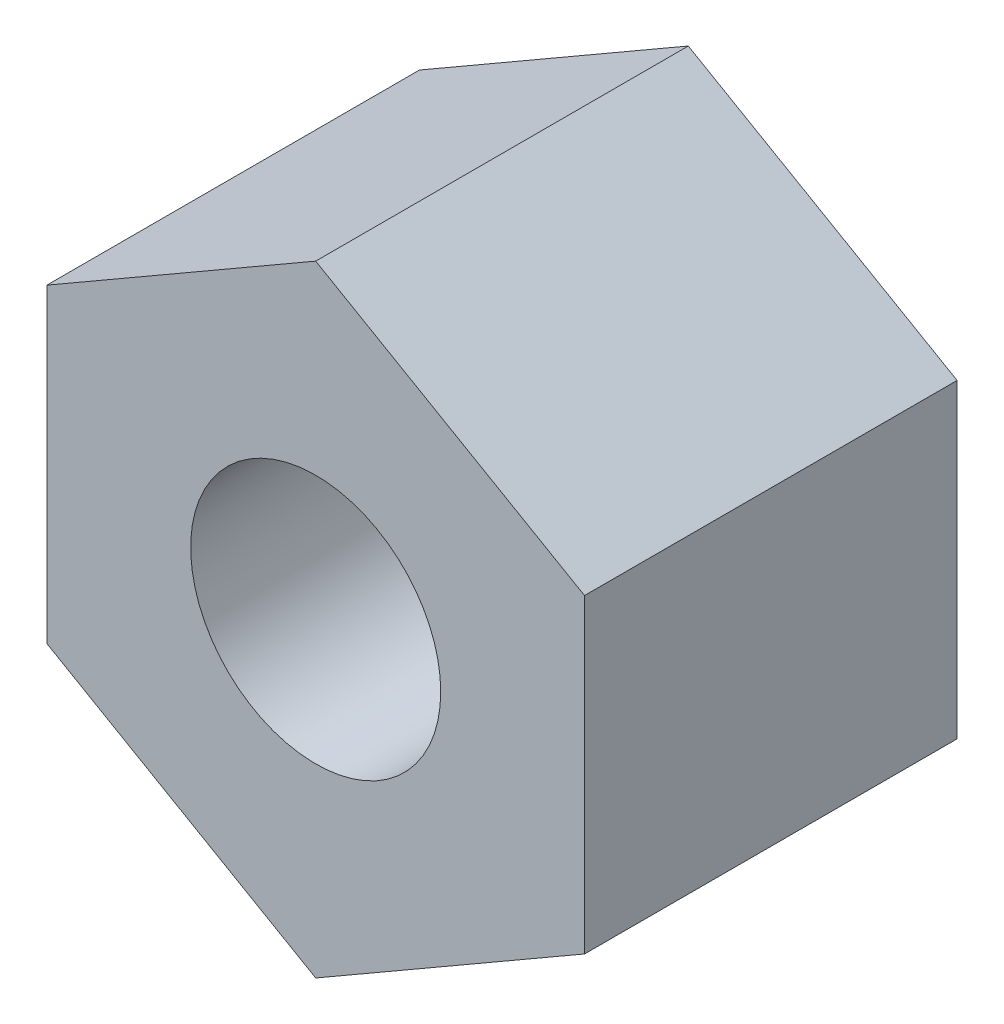
ISO-10303-21;
HEADER;
FILE_DESCRIPTION(('STEP AP214'),'2;1');
FILE_NAME('part.step','',(''),(''),'','','');
FILE_SCHEMA(('AUTOMOTIVE_DESIGN { 1 0 10303 214 1 1 1 1 }'));
ENDSEC;
DATA;
#1=APPLICATION_CONTEXT('core data for automotive mechanical design processes');
#2=APPLICATION_PROTOCOL_DEFINITION('international standard','automotive_design',2000,#1);
#3=PRODUCT_CONTEXT('',#1,'mechanical');
#4=PRODUCT('Part','Part','',(#3));
#5=PRODUCT_RELATED_PRODUCT_CATEGORY('part','',(#4));
#6=PRODUCT_DEFINITION_FORMATION('','',#4);
#7=PRODUCT_DEFINITION_CONTEXT('part definition',#1,'design');
#8=PRODUCT_DEFINITION('design','',#6,#7);
#9=PRODUCT_DEFINITION_SHAPE('','',#8);
#10=(LENGTH_UNIT() NAMED_UNIT(*) SI_UNIT(.MILLI.,.METRE.));
#11=(NAMED_UNIT(*) PLANE_ANGLE_UNIT() SI_UNIT($,.RADIAN.));
#12=(NAMED_UNIT(*) SI_UNIT($,.STERADIAN.) SOLID_ANGLE_UNIT());
#13=UNCERTAINTY_MEASURE_WITH_UNIT(LENGTH_MEASURE(1.E-05),#10,'distance_accuracy_value','');
#14=(GEOMETRIC_REPRESENTATION_CONTEXT(3) GLOBAL_UNCERTAINTY_ASSIGNED_CONTEXT((#13)) GLOBAL_UNIT_ASSIGNED_CONTEXT((#10,
#11,#12)) REPRESENTATION_CONTEXT('',''));
#15=CARTESIAN_POINT('',(0.,0.,0.));
#16=DIRECTION('',(0.,0.,1.));
#17=DIRECTION('',(1.,0.,0.));
#18=AXIS2_PLACEMENT_3D('',#15,#16,#17);
#19=CARTESIAN_POINT('',(4.29999999999997,2.48260615751544,5.96));
#20=DIRECTION('',(-0.499999999999995,-0.866025403784441,0.));
#21=DIRECTION('',(0.866025403784442,-0.499999999999995,0.));
#22=AXIS2_PLACEMENT_3D('',#19,#20,#21);
#23=PLANE('',#22);
#24=DIRECTION('',(-0.866025403784441,0.499999999999995,0.));
#25=VECTOR('',#24,1.);
#26=CARTESIAN_POINT('',(4.29999999999997,2.48260615751544,0.));
#27=LINE('',#26,#25);
#28=CARTESIAN_POINT('',(4.29999999999997,2.48260615751544,0.));
#29=VERTEX_POINT('',#28);
#30=CARTESIAN_POINT('',(0.,4.96521231503079,0.));
#31=VERTEX_POINT('',#30);
#32=EDGE_CURVE('E123',#29,#31,#27,.T.);
#33=ORIENTED_EDGE('',*,*,#32,.T.);
#34=DIRECTION('',(0.,0.,-1.));
#35=VECTOR('',#34,1.);
#36=CARTESIAN_POINT('',(0.,4.96521231503079,5.96));
#37=LINE('',#36,#35);
#38=CARTESIAN_POINT('',(0.,4.96521231503079,5.96));
#39=VERTEX_POINT('',#38);
#40=EDGE_CURVE('E11',#39,#31,#37,.T.);
#41=ORIENTED_EDGE('',*,*,#40,.F.);
#42=DIRECTION('',(-0.866025403784441,0.499999999999995,0.));
#43=VECTOR('',#42,1.);
#44=CARTESIAN_POINT('',(4.29999999999997,2.48260615751544,5.96));
#45=LINE('',#44,#43);
#46=CARTESIAN_POINT('',(4.29999999999997,2.48260615751544,5.96));
#47=VERTEX_POINT('',#46);
#48=EDGE_CURVE('E134',#47,#39,#45,.T.);
#49=ORIENTED_EDGE('',*,*,#48,.F.);
#50=DIRECTION('',(0.,0.,-1.));
#51=VECTOR('',#50,1.);
#52=CARTESIAN_POINT('',(4.29999999999997,2.48260615751544,5.96));
#53=LINE('',#52,#51);
#54=EDGE_CURVE('E119',#47,#29,#53,.T.);
#55=ORIENTED_EDGE('',*,*,#54,.T.);
#56=EDGE_LOOP('',(#33,#41,#49,#55));
#57=FACE_BOUND('',#56,.T.);
#58=ADVANCED_FACE('F39',(#57),#23,.F.);
#59=CARTESIAN_POINT('',(0.,4.96521231503079,5.96));
#60=DIRECTION('',(0.500000000000001,-0.866025403784438,0.));
#61=DIRECTION('',(0.866025403784438,0.500000000000001,0.));
#62=AXIS2_PLACEMENT_3D('',#59,#60,#61);
#63=PLANE('',#62);
#64=DIRECTION('',(-0.866025403784438,-0.500000000000001,0.));
#65=VECTOR('',#64,1.);
#66=CARTESIAN_POINT('',(0.,4.96521231503079,0.));
#67=LINE('',#66,#65);
#68=CARTESIAN_POINT('',(-4.30000000000001,2.48260615751538,0.));
#69=VERTEX_POINT('',#68);
#70=EDGE_CURVE('E126',#31,#69,#67,.T.);
#71=ORIENTED_EDGE('',*,*,#70,.T.);
#72=DIRECTION('',(0.,0.,-1.));
#73=VECTOR('',#72,1.);
#74=CARTESIAN_POINT('',(-4.30000000000001,2.48260615751538,5.96));
#75=LINE('',#74,#73);
#76=CARTESIAN_POINT('',(-4.30000000000001,2.48260615751538,5.96));
#77=VERTEX_POINT('',#76);
#78=EDGE_CURVE('E47',#77,#69,#75,.T.);
#79=ORIENTED_EDGE('',*,*,#78,.F.);
#80=DIRECTION('',(-0.866025403784438,-0.500000000000001,0.));
#81=VECTOR('',#80,1.);
#82=CARTESIAN_POINT('',(0.,4.96521231503079,5.96));
#83=LINE('',#82,#81);
#84=EDGE_CURVE('E92',#39,#77,#83,.T.);
#85=ORIENTED_EDGE('',*,*,#84,.F.);
#86=ORIENTED_EDGE('',*,*,#40,.T.);
#87=EDGE_LOOP('',(#71,#79,#85,#86));
#88=FACE_BOUND('',#87,.T.);
#89=ADVANCED_FACE('F159',(#88),#63,.F.);
#90=CARTESIAN_POINT('',(-4.30000000000001,2.48260615751538,5.96));
#91=DIRECTION('',(1.,0.,0.));
#92=DIRECTION('',(0.,1.,0.));
#93=AXIS2_PLACEMENT_3D('',#90,#91,#92);
#94=PLANE('',#93);
#95=DIRECTION('',(0.,-1.,0.));
#96=VECTOR('',#95,1.);
#97=CARTESIAN_POINT('',(-4.30000000000001,2.48260615751538,0.));
#98=LINE('',#97,#96);
#99=CARTESIAN_POINT('',(-4.29999999999999,-2.48260615751541,0.));
#100=VERTEX_POINT('',#99);
#101=EDGE_CURVE('E129',#69,#100,#98,.T.);
#102=ORIENTED_EDGE('',*,*,#101,.T.);
#103=DIRECTION('',(0.,0.,-1.));
#104=VECTOR('',#103,1.);
#105=CARTESIAN_POINT('',(-4.29999999999999,-2.48260615751541,5.96));
#106=LINE('',#105,#104);
#107=CARTESIAN_POINT('',(-4.29999999999999,-2.48260615751541,5.96));
#108=VERTEX_POINT('',#107);
#109=EDGE_CURVE('E114',#108,#100,#106,.T.);
#110=ORIENTED_EDGE('',*,*,#109,.F.);
#111=DIRECTION('',(0.,-1.,0.));
#112=VECTOR('',#111,1.);
#113=CARTESIAN_POINT('',(-4.30000000000001,2.48260615751538,5.96));
#114=LINE('',#113,#112);
#115=EDGE_CURVE('E105',#77,#108,#114,.T.);
#116=ORIENTED_EDGE('',*,*,#115,.F.);
#117=ORIENTED_EDGE('',*,*,#78,.T.);
#118=EDGE_LOOP('',(#102,#110,#116,#117));
#119=FACE_BOUND('',#118,.T.);
#120=ADVANCED_FACE('F140',(#119),#94,.F.);
#121=CARTESIAN_POINT('',(-4.29999999999999,-2.48260615751541,5.96));
#122=DIRECTION('',(0.499999999999995,0.866025403784442,0.));
#123=DIRECTION('',(-0.866025403784442,0.499999999999995,0.));
#124=AXIS2_PLACEMENT_3D('',#121,#122,#123);
#125=PLANE('',#124);
#126=DIRECTION('',(0.866025403784442,-0.499999999999995,0.));
#127=VECTOR('',#126,1.);
#128=CARTESIAN_POINT('',(-4.29999999999999,-2.48260615751541,0.));
#129=LINE('',#128,#127);
#130=CARTESIAN_POINT('',(0.,-4.96521231503079,0.));
#131=VERTEX_POINT('',#130);
#132=EDGE_CURVE('E113',#100,#131,#129,.T.);
#133=ORIENTED_EDGE('',*,*,#132,.T.);
#134=DIRECTION('',(0.,0.,-1.));
#135=VECTOR('',#134,1.);
#136=CARTESIAN_POINT('',(0.,-4.96521231503079,5.96));
#137=LINE('',#136,#135);
#138=CARTESIAN_POINT('',(0.,-4.96521231503079,5.96));
#139=VERTEX_POINT('',#138);
#140=EDGE_CURVE('E110',#139,#131,#137,.T.);
#141=ORIENTED_EDGE('',*,*,#140,.F.);
#142=DIRECTION('',(0.866025403784442,-0.499999999999995,0.));
#143=VECTOR('',#142,1.);
#144=CARTESIAN_POINT('',(-4.29999999999999,-2.48260615751541,5.96));
#145=LINE('',#144,#143);
#146=EDGE_CURVE('E99',#108,#139,#145,.T.);
#147=ORIENTED_EDGE('',*,*,#146,.F.);
#148=ORIENTED_EDGE('',*,*,#109,.T.);
#149=EDGE_LOOP('',(#133,#141,#147,#148));
#150=FACE_BOUND('',#149,.T.);
#151=ADVANCED_FACE('F111',(#150),#125,.F.);
#152=CARTESIAN_POINT('',(0.,-4.96521231503079,5.96));
#153=DIRECTION('',(-0.500000000000007,0.866025403784434,0.));
#154=DIRECTION('',(-0.866025403784435,-0.500000000000007,0.));
#155=AXIS2_PLACEMENT_3D('',#152,#153,#154);
#156=PLANE('',#155);
#157=DIRECTION('',(0.866025403784434,0.500000000000007,0.));
#158=VECTOR('',#157,1.);
#159=CARTESIAN_POINT('',(0.,-4.96521231503079,0.));
#160=LINE('',#159,#158);
#161=CARTESIAN_POINT('',(4.30000000000003,-2.48260615751535,0.));
#162=VERTEX_POINT('',#161);
#163=EDGE_CURVE('E78',#131,#162,#160,.T.);
#164=ORIENTED_EDGE('',*,*,#163,.T.);
#165=DIRECTION('',(0.,0.,-1.));
#166=VECTOR('',#165,1.);
#167=CARTESIAN_POINT('',(4.30000000000003,-2.48260615751535,5.96));
#168=LINE('',#167,#166);
#169=CARTESIAN_POINT('',(4.30000000000003,-2.48260615751535,5.96));
#170=VERTEX_POINT('',#169);
#171=EDGE_CURVE('E115',#170,#162,#168,.T.);
#172=ORIENTED_EDGE('',*,*,#171,.F.);
#173=DIRECTION('',(0.866025403784434,0.500000000000007,0.));
#174=VECTOR('',#173,1.);
#175=CARTESIAN_POINT('',(0.,-4.96521231503079,5.96));
#176=LINE('',#175,#174);
#177=EDGE_CURVE('E103',#139,#170,#176,.T.);
#178=ORIENTED_EDGE('',*,*,#177,.F.);
#179=ORIENTED_EDGE('',*,*,#140,.T.);
#180=EDGE_LOOP('',(#164,#172,#178,#179));
#181=FACE_BOUND('',#180,.T.);
#182=ADVANCED_FACE('F117',(#181),#156,.F.);
#183=CARTESIAN_POINT('',(4.30000000000003,-2.48260615751535,5.96));
#184=DIRECTION('',(-1.,0.,0.));
#185=DIRECTION('',(0.,-1.,0.));
#186=AXIS2_PLACEMENT_3D('',#183,#184,#185);
#187=PLANE('',#186);
#188=DIRECTION('',(0.,1.,0.));
#189=VECTOR('',#188,1.);
#190=CARTESIAN_POINT('',(4.30000000000003,-2.48260615751535,0.));
#191=LINE('',#190,#189);
#192=EDGE_CURVE('E84',#162,#29,#191,.T.);
#193=ORIENTED_EDGE('',*,*,#192,.T.);
#194=ORIENTED_EDGE('',*,*,#54,.F.);
#195=DIRECTION('',(0.,1.,0.));
#196=VECTOR('',#195,1.);
#197=CARTESIAN_POINT('',(4.30000000000003,-2.48260615751535,5.96));
#198=LINE('',#197,#196);
#199=EDGE_CURVE('E55',#170,#47,#198,.T.);
#200=ORIENTED_EDGE('',*,*,#199,.F.);
#201=ORIENTED_EDGE('',*,*,#171,.T.);
#202=EDGE_LOOP('',(#193,#194,#200,#201));
#203=FACE_BOUND('',#202,.T.);
#204=ADVANCED_FACE('F147',(#203),#187,.F.);
#205=CARTESIAN_POINT('',(0.,0.,5.96));
#206=DIRECTION('',(0.,0.,1.));
#207=DIRECTION('',(1.,0.,0.));
#208=AXIS2_PLACEMENT_3D('',#205,#206,#207);
#209=PLANE('',#208);
#210=CARTESIAN_POINT('',(0.,0.,5.96));
#211=DIRECTION('',(0.,0.,1.));
#212=DIRECTION('',(1.,0.,0.));
#213=AXIS2_PLACEMENT_3D('',#210,#211,#212);
#214=CIRCLE('',#213,2.);
#215=CARTESIAN_POINT('',(2.,0.,5.96));
#216=VERTEX_POINT('',#215);
#217=EDGE_CURVE('E127',#216,#216,#214,.T.);
#218=ORIENTED_EDGE('',*,*,#217,.F.);
#219=EDGE_LOOP('',(#218));
#220=FACE_BOUND('',#219,.T.);
#221=ORIENTED_EDGE('',*,*,#48,.T.);
#222=ORIENTED_EDGE('',*,*,#84,.T.);
#223=ORIENTED_EDGE('',*,*,#115,.T.);
#224=ORIENTED_EDGE('',*,*,#146,.T.);
#225=ORIENTED_EDGE('',*,*,#177,.T.);
#226=ORIENTED_EDGE('',*,*,#199,.T.);
#227=EDGE_LOOP('',(#221,#222,#223,#224,#225,#226));
#228=FACE_BOUND('',#227,.T.);
#229=ADVANCED_FACE('F101',(#220,#228),#209,.T.);
#230=CARTESIAN_POINT('',(0.,0.,0.));
#231=DIRECTION('',(0.,0.,1.));
#232=DIRECTION('',(1.,0.,0.));
#233=AXIS2_PLACEMENT_3D('',#230,#231,#232);
#234=PLANE('',#233);
#235=CARTESIAN_POINT('',(0.,0.,0.));
#236=DIRECTION('',(0.,0.,1.));
#237=DIRECTION('',(1.,0.,0.));
#238=AXIS2_PLACEMENT_3D('',#235,#236,#237);
#239=CIRCLE('',#238,2.);
#240=CARTESIAN_POINT('',(2.,0.,0.));
#241=VERTEX_POINT('',#240);
#242=EDGE_CURVE('E215',#241,#241,#239,.T.);
#243=ORIENTED_EDGE('',*,*,#242,.T.);
#244=EDGE_LOOP('',(#243));
#245=FACE_BOUND('',#244,.T.);
#246=ORIENTED_EDGE('',*,*,#32,.F.);
#247=ORIENTED_EDGE('',*,*,#192,.F.);
#248=ORIENTED_EDGE('',*,*,#163,.F.);
#249=ORIENTED_EDGE('',*,*,#132,.F.);
#250=ORIENTED_EDGE('',*,*,#101,.F.);
#251=ORIENTED_EDGE('',*,*,#70,.F.);
#252=EDGE_LOOP('',(#246,#247,#248,#249,#250,#251));
#253=FACE_BOUND('',#252,.T.);
#254=ADVANCED_FACE('F143',(#245,#253),#234,.F.);
#255=CARTESIAN_POINT('',(0.,0.,5.961));
#256=DIRECTION('',(0.,0.,-1.));
#257=DIRECTION('',(-1.,0.,0.));
#258=AXIS2_PLACEMENT_3D('',#255,#256,#257);
#259=CYLINDRICAL_SURFACE('',#258,2.);
#260=ORIENTED_EDGE('',*,*,#217,.T.);
#261=EDGE_LOOP('',(#260));
#262=FACE_BOUND('',#261,.T.);
#263=ORIENTED_EDGE('',*,*,#242,.F.);
#264=EDGE_LOOP('',(#263));
#265=FACE_BOUND('',#264,.T.);
#266=ADVANCED_FACE('F198',(#262,#265),#259,.F.);
#267=CLOSED_SHELL('',(#58,#89,#120,#151,#182,#204,#229,#254,#266));
#268=MANIFOLD_SOLID_BREP('B2',#267);
#269=ADVANCED_BREP_SHAPE_REPRESENTATION('',(#18,#268),#14);
#270=SHAPE_DEFINITION_REPRESENTATION(#9,#269);
ENDSEC;
END-ISO-10303-21;
